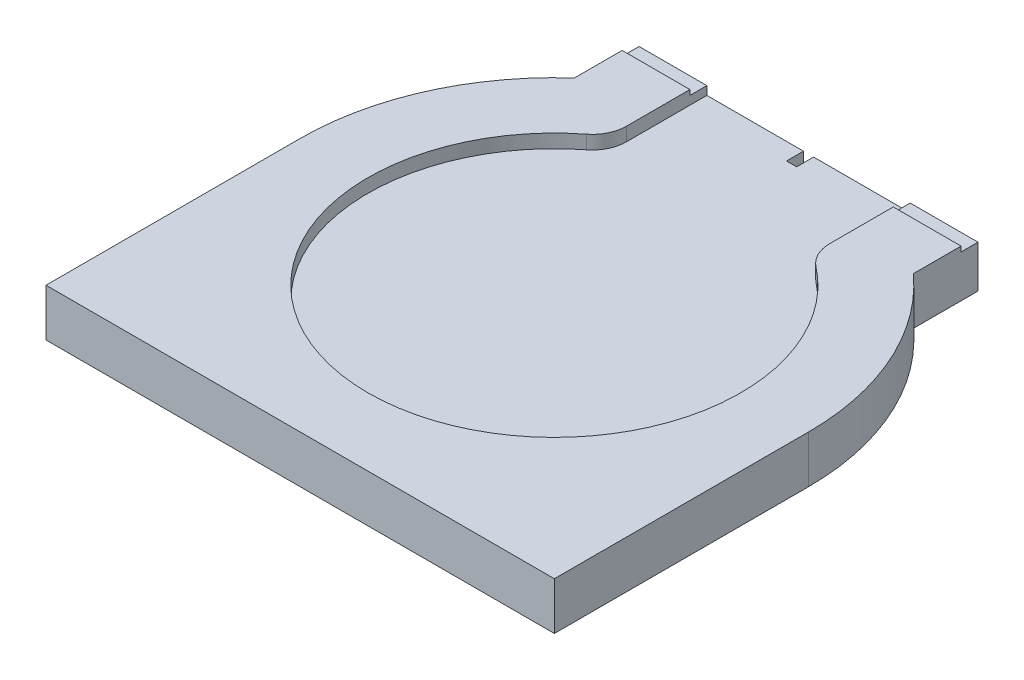
ISO-10303-21;
HEADER;
FILE_DESCRIPTION(('STEP AP214'),'2;1');
FILE_NAME('part.step','',(''),(''),'','','');
FILE_SCHEMA(('AUTOMOTIVE_DESIGN { 1 0 10303 214 1 1 1 1 }'));
ENDSEC;
DATA;
#1=APPLICATION_CONTEXT('core data for automotive mechanical design processes');
#2=APPLICATION_PROTOCOL_DEFINITION('international standard','automotive_design',2000,#1);
#3=PRODUCT_CONTEXT('',#1,'mechanical');
#4=PRODUCT('Part','Part','',(#3));
#5=PRODUCT_RELATED_PRODUCT_CATEGORY('part','',(#4));
#6=PRODUCT_DEFINITION_FORMATION('','',#4);
#7=PRODUCT_DEFINITION_CONTEXT('part definition',#1,'design');
#8=PRODUCT_DEFINITION('design','',#6,#7);
#9=PRODUCT_DEFINITION_SHAPE('','',#8);
#10=(LENGTH_UNIT() NAMED_UNIT(*) SI_UNIT(.MILLI.,.METRE.));
#11=(NAMED_UNIT(*) PLANE_ANGLE_UNIT() SI_UNIT($,.RADIAN.));
#12=(NAMED_UNIT(*) SI_UNIT($,.STERADIAN.) SOLID_ANGLE_UNIT());
#13=UNCERTAINTY_MEASURE_WITH_UNIT(LENGTH_MEASURE(1.E-05),#10,'distance_accuracy_value','');
#14=(GEOMETRIC_REPRESENTATION_CONTEXT(3) GLOBAL_UNCERTAINTY_ASSIGNED_CONTEXT((#13)) GLOBAL_UNIT_ASSIGNED_CONTEXT((#10,
#11,#12)) REPRESENTATION_CONTEXT('',''));
#15=CARTESIAN_POINT('',(0.,0.,0.));
#16=DIRECTION('',(0.,0.,1.));
#17=DIRECTION('',(1.,0.,0.));
#18=AXIS2_PLACEMENT_3D('',#15,#16,#17);
#19=CARTESIAN_POINT('',(3.,0.8,-7.5));
#20=DIRECTION('',(0.,0.,1.));
#21=DIRECTION('',(1.,0.,0.));
#22=AXIS2_PLACEMENT_3D('',#19,#20,#21);
#23=PLANE('',#22);
#24=DIRECTION('',(0.,-1.,0.));
#25=VECTOR('',#24,1.);
#26=CARTESIAN_POINT('',(-5.,0.8,-7.5));
#27=LINE('',#26,#25);
#28=CARTESIAN_POINT('',(-5.,0.25,-7.5));
#29=VERTEX_POINT('',#28);
#30=CARTESIAN_POINT('',(-5.,-1.,-7.5));
#31=VERTEX_POINT('',#30);
#32=EDGE_CURVE('E340',#29,#31,#27,.T.);
#33=ORIENTED_EDGE('',*,*,#32,.F.);
#34=DIRECTION('',(-1.,0.,0.));
#35=VECTOR('',#34,1.);
#36=CARTESIAN_POINT('',(-0.15,0.25,-7.5));
#37=LINE('',#36,#35);
#38=CARTESIAN_POINT('',(-3.,0.25,-7.5));
#39=VERTEX_POINT('',#38);
#40=EDGE_CURVE('E228',#39,#29,#37,.T.);
#41=ORIENTED_EDGE('',*,*,#40,.F.);
#42=DIRECTION('',(0.,-1.,0.));
#43=VECTOR('',#42,1.);
#44=CARTESIAN_POINT('',(-3.,0.8,-7.5));
#45=LINE('',#44,#43);
#46=CARTESIAN_POINT('',(-3.,0.,-7.5));
#47=VERTEX_POINT('',#46);
#48=EDGE_CURVE('E343',#39,#47,#45,.T.);
#49=ORIENTED_EDGE('',*,*,#48,.T.);
#50=DIRECTION('',(1.,0.,0.));
#51=VECTOR('',#50,1.);
#52=CARTESIAN_POINT('',(-3.,0.,-7.5));
#53=LINE('',#52,#51);
#54=CARTESIAN_POINT('',(-0.15,0.,-7.5));
#55=VERTEX_POINT('',#54);
#56=EDGE_CURVE('E285',#47,#55,#53,.T.);
#57=ORIENTED_EDGE('',*,*,#56,.T.);
#58=DIRECTION('',(0.,1.,0.));
#59=VECTOR('',#58,1.);
#60=CARTESIAN_POINT('',(-0.15,0.25,-7.5));
#61=LINE('',#60,#59);
#62=CARTESIAN_POINT('',(-0.15,-1.,-7.5));
#63=VERTEX_POINT('',#62);
#64=EDGE_CURVE('E225',#63,#55,#61,.T.);
#65=ORIENTED_EDGE('',*,*,#64,.F.);
#66=DIRECTION('',(1.,0.,0.));
#67=VECTOR('',#66,1.);
#68=CARTESIAN_POINT('',(-3.,-1.,-7.5));
#69=LINE('',#68,#67);
#70=EDGE_CURVE('E251',#31,#63,#69,.T.);
#71=ORIENTED_EDGE('',*,*,#70,.F.);
#72=EDGE_LOOP('',(#33,#41,#49,#57,#65,#71));
#73=FACE_BOUND('',#72,.T.);
#74=ADVANCED_FACE('F40',(#73),#23,.F.);
#75=CARTESIAN_POINT('',(-4.,0.8,-5.1234753829798));
#76=DIRECTION('',(0.,-1.,0.));
#77=DIRECTION('',(0.,0.,-1.));
#78=AXIS2_PLACEMENT_3D('',#75,#76,#77);
#79=CYLINDRICAL_SURFACE('',#78,1.);
#80=DIRECTION('',(0.,-1.,0.));
#81=VECTOR('',#80,1.);
#82=CARTESIAN_POINT('',(-3.,0.8,-5.1234753829798));
#83=LINE('',#82,#81);
#84=CARTESIAN_POINT('',(-3.,0.4,-5.1234753829798));
#85=VERTEX_POINT('',#84);
#86=CARTESIAN_POINT('',(-3.,0.,-5.1234753829798));
#87=VERTEX_POINT('',#86);
#88=EDGE_CURVE('E346',#85,#87,#83,.T.);
#89=ORIENTED_EDGE('',*,*,#88,.F.);
#90=CARTESIAN_POINT('',(-4.,0.4,-5.1234753829798));
#91=DIRECTION('',(0.,-1.,0.));
#92=DIRECTION('',(0.,0.,-1.));
#93=AXIS2_PLACEMENT_3D('',#90,#91,#92);
#94=CIRCLE('',#93,1.);
#95=CARTESIAN_POINT('',(-3.38461538461538,0.4,-4.33524840098291));
#96=VERTEX_POINT('',#95);
#97=EDGE_CURVE('E399',#85,#96,#94,.T.);
#98=ORIENTED_EDGE('',*,*,#97,.T.);
#99=DIRECTION('',(0.,-1.,0.));
#100=VECTOR('',#99,1.);
#101=CARTESIAN_POINT('',(-3.38461538461538,0.8,-4.33524840098291));
#102=LINE('',#101,#100);
#103=CARTESIAN_POINT('',(-3.38461538461538,0.,-4.33524840098291));
#104=VERTEX_POINT('',#103);
#105=EDGE_CURVE('E308',#96,#104,#102,.T.);
#106=ORIENTED_EDGE('',*,*,#105,.T.);
#107=CARTESIAN_POINT('',(-4.,0.,-5.1234753829798));
#108=DIRECTION('',(0.,1.,0.));
#109=DIRECTION('',(0.,0.,1.));
#110=AXIS2_PLACEMENT_3D('',#107,#108,#109);
#111=CIRCLE('',#110,1.);
#112=EDGE_CURVE('E284',#104,#87,#111,.T.);
#113=ORIENTED_EDGE('',*,*,#112,.T.);
#114=EDGE_LOOP('',(#89,#98,#106,#113));
#115=FACE_BOUND('',#114,.T.);
#116=ADVANCED_FACE('F42',(#115),#79,.T.);
#117=CARTESIAN_POINT('',(-3.,0.8,-5.5));
#118=DIRECTION('',(-1.,0.,0.));
#119=DIRECTION('',(0.,0.,1.));
#120=AXIS2_PLACEMENT_3D('',#117,#118,#119);
#121=PLANE('',#120);
#122=DIRECTION('',(0.,-1.,0.));
#123=VECTOR('',#122,1.);
#124=CARTESIAN_POINT('',(-3.,0.8,-7.));
#125=LINE('',#124,#123);
#126=CARTESIAN_POINT('',(-3.,0.4,-7.));
#127=VERTEX_POINT('',#126);
#128=CARTESIAN_POINT('',(-3.,0.25,-7.));
#129=VERTEX_POINT('',#128);
#130=EDGE_CURVE('E245',#127,#129,#125,.T.);
#131=ORIENTED_EDGE('',*,*,#130,.F.);
#132=DIRECTION('',(0.,0.,1.));
#133=VECTOR('',#132,1.);
#134=CARTESIAN_POINT('',(-3.,0.4,-5.5));
#135=LINE('',#134,#133);
#136=EDGE_CURVE('E55',#127,#85,#135,.T.);
#137=ORIENTED_EDGE('',*,*,#136,.T.);
#138=ORIENTED_EDGE('',*,*,#88,.T.);
#139=DIRECTION('',(0.,0.,-1.));
#140=VECTOR('',#139,1.);
#141=CARTESIAN_POINT('',(-3.,0.,-5.5));
#142=LINE('',#141,#140);
#143=EDGE_CURVE('E292',#87,#47,#142,.T.);
#144=ORIENTED_EDGE('',*,*,#143,.T.);
#145=ORIENTED_EDGE('',*,*,#48,.F.);
#146=DIRECTION('',(0.,0.,1.));
#147=VECTOR('',#146,1.);
#148=CARTESIAN_POINT('',(-3.,0.25,-5.5));
#149=LINE('',#148,#147);
#150=EDGE_CURVE('E63',#39,#129,#149,.T.);
#151=ORIENTED_EDGE('',*,*,#150,.T.);
#152=EDGE_LOOP('',(#131,#137,#138,#144,#145,#151));
#153=FACE_BOUND('',#152,.T.);
#154=ADVANCED_FACE('F462',(#153),#121,.F.);
#155=CARTESIAN_POINT('',(-5.,0.8,-7.5));
#156=DIRECTION('',(1.,0.,0.));
#157=DIRECTION('',(0.,0.,-1.));
#158=AXIS2_PLACEMENT_3D('',#155,#156,#157);
#159=PLANE('',#158);
#160=DIRECTION('',(0.,-1.,0.));
#161=VECTOR('',#160,1.);
#162=CARTESIAN_POINT('',(-5.,0.8,-5.59016994374947));
#163=LINE('',#162,#161);
#164=CARTESIAN_POINT('',(-5.,0.4,-5.59016994374947));
#165=VERTEX_POINT('',#164);
#166=CARTESIAN_POINT('',(-5.,-1.,-5.59016994374947));
#167=VERTEX_POINT('',#166);
#168=EDGE_CURVE('E201',#165,#167,#163,.T.);
#169=ORIENTED_EDGE('',*,*,#168,.F.);
#170=DIRECTION('',(0.,0.,-1.));
#171=VECTOR('',#170,1.);
#172=CARTESIAN_POINT('',(-5.,0.4,-7.5));
#173=LINE('',#172,#171);
#174=CARTESIAN_POINT('',(-5.,0.4,-7.));
#175=VERTEX_POINT('',#174);
#176=EDGE_CURVE('E189',#165,#175,#173,.T.);
#177=ORIENTED_EDGE('',*,*,#176,.T.);
#178=DIRECTION('',(0.,1.,0.));
#179=VECTOR('',#178,1.);
#180=CARTESIAN_POINT('',(-5.,0.55,-7.));
#181=LINE('',#180,#179);
#182=CARTESIAN_POINT('',(-5.,0.25,-7.));
#183=VERTEX_POINT('',#182);
#184=EDGE_CURVE('E199',#183,#175,#181,.T.);
#185=ORIENTED_EDGE('',*,*,#184,.F.);
#186=DIRECTION('',(0.,0.,-1.));
#187=VECTOR('',#186,1.);
#188=CARTESIAN_POINT('',(-5.,0.25,-7.));
#189=LINE('',#188,#187);
#190=EDGE_CURVE('E232',#183,#29,#189,.T.);
#191=ORIENTED_EDGE('',*,*,#190,.T.);
#192=ORIENTED_EDGE('',*,*,#32,.T.);
#193=DIRECTION('',(0.,0.,-1.));
#194=VECTOR('',#193,1.);
#195=CARTESIAN_POINT('',(-5.,-1.,-7.5));
#196=LINE('',#195,#194);
#197=EDGE_CURVE('E280',#167,#31,#196,.T.);
#198=ORIENTED_EDGE('',*,*,#197,.F.);
#199=EDGE_LOOP('',(#169,#177,#185,#191,#192,#198));
#200=FACE_BOUND('',#199,.T.);
#201=ADVANCED_FACE('F197',(#200),#159,.F.);
#202=CARTESIAN_POINT('',(0.,0.8,0.));
#203=DIRECTION('',(0.,-1.,0.));
#204=DIRECTION('',(0.,0.,-1.));
#205=AXIS2_PLACEMENT_3D('',#202,#203,#204);
#206=CYLINDRICAL_SURFACE('',#205,7.5);
#207=DIRECTION('',(0.,-1.,0.));
#208=VECTOR('',#207,1.);
#209=CARTESIAN_POINT('',(-7.5,0.8,0.));
#210=LINE('',#209,#208);
#211=CARTESIAN_POINT('',(-7.5,0.4,0.));
#212=VERTEX_POINT('',#211);
#213=CARTESIAN_POINT('',(-7.5,-1.,0.));
#214=VERTEX_POINT('',#213);
#215=EDGE_CURVE('E335',#212,#214,#210,.T.);
#216=ORIENTED_EDGE('',*,*,#215,.F.);
#217=CARTESIAN_POINT('',(0.,0.4,0.));
#218=DIRECTION('',(0.,-1.,0.));
#219=DIRECTION('',(0.,0.,-1.));
#220=AXIS2_PLACEMENT_3D('',#217,#218,#219);
#221=CIRCLE('',#220,7.5);
#222=EDGE_CURVE('E397',#212,#165,#221,.T.);
#223=ORIENTED_EDGE('',*,*,#222,.T.);
#224=ORIENTED_EDGE('',*,*,#168,.T.);
#225=CARTESIAN_POINT('',(0.,-1.,0.));
#226=DIRECTION('',(0.,-1.,0.));
#227=DIRECTION('',(0.,0.,-1.));
#228=AXIS2_PLACEMENT_3D('',#225,#226,#227);
#229=CIRCLE('',#228,7.5);
#230=EDGE_CURVE('E276',#214,#167,#229,.T.);
#231=ORIENTED_EDGE('',*,*,#230,.F.);
#232=EDGE_LOOP('',(#216,#223,#224,#231));
#233=FACE_BOUND('',#232,.T.);
#234=ADVANCED_FACE('F517',(#233),#206,.T.);
#235=CARTESIAN_POINT('',(-7.5,0.8,0.));
#236=DIRECTION('',(1.,0.,0.));
#237=DIRECTION('',(0.,0.,-1.));
#238=AXIS2_PLACEMENT_3D('',#235,#236,#237);
#239=PLANE('',#238);
#240=DIRECTION('',(0.,-1.,0.));
#241=VECTOR('',#240,1.);
#242=CARTESIAN_POINT('',(-7.5,0.8,7.5));
#243=LINE('',#242,#241);
#244=CARTESIAN_POINT('',(-7.5,0.4,7.5));
#245=VERTEX_POINT('',#244);
#246=CARTESIAN_POINT('',(-7.5,-1.,7.5));
#247=VERTEX_POINT('',#246);
#248=EDGE_CURVE('E332',#245,#247,#243,.T.);
#249=ORIENTED_EDGE('',*,*,#248,.F.);
#250=DIRECTION('',(0.,0.,-1.));
#251=VECTOR('',#250,1.);
#252=CARTESIAN_POINT('',(-7.5,0.4,0.));
#253=LINE('',#252,#251);
#254=EDGE_CURVE('E222',#245,#212,#253,.T.);
#255=ORIENTED_EDGE('',*,*,#254,.T.);
#256=ORIENTED_EDGE('',*,*,#215,.T.);
#257=DIRECTION('',(0.,0.,-1.));
#258=VECTOR('',#257,1.);
#259=CARTESIAN_POINT('',(-7.5,-1.,0.));
#260=LINE('',#259,#258);
#261=EDGE_CURVE('E272',#247,#214,#260,.T.);
#262=ORIENTED_EDGE('',*,*,#261,.F.);
#263=EDGE_LOOP('',(#249,#255,#256,#262));
#264=FACE_BOUND('',#263,.T.);
#265=ADVANCED_FACE('F513',(#264),#239,.F.);
#266=CARTESIAN_POINT('',(-7.5,0.8,7.5));
#267=DIRECTION('',(0.,0.,-1.));
#268=DIRECTION('',(-1.,0.,0.));
#269=AXIS2_PLACEMENT_3D('',#266,#267,#268);
#270=PLANE('',#269);
#271=DIRECTION('',(0.,-1.,0.));
#272=VECTOR('',#271,1.);
#273=CARTESIAN_POINT('',(7.5,0.8,7.5));
#274=LINE('',#273,#272);
#275=CARTESIAN_POINT('',(7.5,0.4,7.5));
#276=VERTEX_POINT('',#275);
#277=CARTESIAN_POINT('',(7.5,-1.,7.5));
#278=VERTEX_POINT('',#277);
#279=EDGE_CURVE('E329',#276,#278,#274,.T.);
#280=ORIENTED_EDGE('',*,*,#279,.F.);
#281=DIRECTION('',(-1.,0.,0.));
#282=VECTOR('',#281,1.);
#283=CARTESIAN_POINT('',(-7.5,0.4,7.5));
#284=LINE('',#283,#282);
#285=EDGE_CURVE('E420',#276,#245,#284,.T.);
#286=ORIENTED_EDGE('',*,*,#285,.T.);
#287=ORIENTED_EDGE('',*,*,#248,.T.);
#288=DIRECTION('',(-1.,0.,0.));
#289=VECTOR('',#288,1.);
#290=CARTESIAN_POINT('',(-7.5,-1.,7.5));
#291=LINE('',#290,#289);
#292=EDGE_CURVE('E268',#278,#247,#291,.T.);
#293=ORIENTED_EDGE('',*,*,#292,.F.);
#294=EDGE_LOOP('',(#280,#286,#287,#293));
#295=FACE_BOUND('',#294,.T.);
#296=ADVANCED_FACE('F509',(#295),#270,.F.);
#297=CARTESIAN_POINT('',(7.5,0.8,7.5));
#298=DIRECTION('',(-1.,0.,0.));
#299=DIRECTION('',(0.,0.,1.));
#300=AXIS2_PLACEMENT_3D('',#297,#298,#299);
#301=PLANE('',#300);
#302=DIRECTION('',(0.,-1.,0.));
#303=VECTOR('',#302,1.);
#304=CARTESIAN_POINT('',(7.5,0.8,0.));
#305=LINE('',#304,#303);
#306=CARTESIAN_POINT('',(7.5,0.4,0.));
#307=VERTEX_POINT('',#306);
#308=CARTESIAN_POINT('',(7.5,-1.,0.));
#309=VERTEX_POINT('',#308);
#310=EDGE_CURVE('E326',#307,#309,#305,.T.);
#311=ORIENTED_EDGE('',*,*,#310,.F.);
#312=DIRECTION('',(0.,0.,1.));
#313=VECTOR('',#312,1.);
#314=CARTESIAN_POINT('',(7.5,0.4,7.5));
#315=LINE('',#314,#313);
#316=EDGE_CURVE('E416',#307,#276,#315,.T.);
#317=ORIENTED_EDGE('',*,*,#316,.T.);
#318=ORIENTED_EDGE('',*,*,#279,.T.);
#319=DIRECTION('',(0.,0.,1.));
#320=VECTOR('',#319,1.);
#321=CARTESIAN_POINT('',(7.5,-1.,7.5));
#322=LINE('',#321,#320);
#323=EDGE_CURVE('E264',#309,#278,#322,.T.);
#324=ORIENTED_EDGE('',*,*,#323,.F.);
#325=EDGE_LOOP('',(#311,#317,#318,#324));
#326=FACE_BOUND('',#325,.T.);
#327=ADVANCED_FACE('F502',(#326),#301,.F.);
#328=CARTESIAN_POINT('',(0.,0.8,0.));
#329=DIRECTION('',(0.,-1.,0.));
#330=DIRECTION('',(0.,0.,-1.));
#331=AXIS2_PLACEMENT_3D('',#328,#329,#330);
#332=CYLINDRICAL_SURFACE('',#331,7.5);
#333=DIRECTION('',(0.,-1.,0.));
#334=VECTOR('',#333,1.);
#335=CARTESIAN_POINT('',(5.,0.8,-5.59016994374947));
#336=LINE('',#335,#334);
#337=CARTESIAN_POINT('',(5.,0.4,-5.59016994374947));
#338=VERTEX_POINT('',#337);
#339=CARTESIAN_POINT('',(5.,-1.,-5.59016994374947));
#340=VERTEX_POINT('',#339);
#341=EDGE_CURVE('E323',#338,#340,#336,.T.);
#342=ORIENTED_EDGE('',*,*,#341,.F.);
#343=CARTESIAN_POINT('',(0.,0.4,0.));
#344=DIRECTION('',(0.,-1.,0.));
#345=DIRECTION('',(0.,0.,-1.));
#346=AXIS2_PLACEMENT_3D('',#343,#344,#345);
#347=CIRCLE('',#346,7.5);
#348=EDGE_CURVE('E412',#338,#307,#347,.T.);
#349=ORIENTED_EDGE('',*,*,#348,.T.);
#350=ORIENTED_EDGE('',*,*,#310,.T.);
#351=CARTESIAN_POINT('',(0.,-1.,0.));
#352=DIRECTION('',(0.,-1.,0.));
#353=DIRECTION('',(0.,0.,-1.));
#354=AXIS2_PLACEMENT_3D('',#351,#352,#353);
#355=CIRCLE('',#354,7.5);
#356=EDGE_CURVE('E260',#340,#309,#355,.T.);
#357=ORIENTED_EDGE('',*,*,#356,.F.);
#358=EDGE_LOOP('',(#342,#349,#350,#357));
#359=FACE_BOUND('',#358,.T.);
#360=ADVANCED_FACE('F498',(#359),#332,.T.);
#361=CARTESIAN_POINT('',(5.,0.8,-7.5));
#362=DIRECTION('',(-1.,0.,0.));
#363=DIRECTION('',(0.,0.,1.));
#364=AXIS2_PLACEMENT_3D('',#361,#362,#363);
#365=PLANE('',#364);
#366=DIRECTION('',(0.,-1.,0.));
#367=VECTOR('',#366,1.);
#368=CARTESIAN_POINT('',(5.,0.55,-7.));
#369=LINE('',#368,#367);
#370=CARTESIAN_POINT('',(5.,0.4,-7.));
#371=VERTEX_POINT('',#370);
#372=CARTESIAN_POINT('',(5.,0.25,-7.));
#373=VERTEX_POINT('',#372);
#374=EDGE_CURVE('E231',#371,#373,#369,.T.);
#375=ORIENTED_EDGE('',*,*,#374,.F.);
#376=DIRECTION('',(0.,0.,1.));
#377=VECTOR('',#376,1.);
#378=CARTESIAN_POINT('',(5.,0.4,-7.5));
#379=LINE('',#378,#377);
#380=EDGE_CURVE('E408',#371,#338,#379,.T.);
#381=ORIENTED_EDGE('',*,*,#380,.T.);
#382=ORIENTED_EDGE('',*,*,#341,.T.);
#383=DIRECTION('',(0.,0.,1.));
#384=VECTOR('',#383,1.);
#385=CARTESIAN_POINT('',(5.,-1.,-5.59016994374947));
#386=LINE('',#385,#384);
#387=CARTESIAN_POINT('',(5.,-1.,-7.5));
#388=VERTEX_POINT('',#387);
#389=EDGE_CURVE('E255',#388,#340,#386,.T.);
#390=ORIENTED_EDGE('',*,*,#389,.F.);
#391=DIRECTION('',(0.,-1.,0.));
#392=VECTOR('',#391,1.);
#393=CARTESIAN_POINT('',(5.,0.8,-7.5));
#394=LINE('',#393,#392);
#395=CARTESIAN_POINT('',(5.,0.25,-7.5));
#396=VERTEX_POINT('',#395);
#397=EDGE_CURVE('E320',#396,#388,#394,.T.);
#398=ORIENTED_EDGE('',*,*,#397,.F.);
#399=DIRECTION('',(0.,0.,-1.));
#400=VECTOR('',#399,1.);
#401=CARTESIAN_POINT('',(5.,0.25,-7.));
#402=LINE('',#401,#400);
#403=EDGE_CURVE('E208',#373,#396,#402,.T.);
#404=ORIENTED_EDGE('',*,*,#403,.F.);
#405=EDGE_LOOP('',(#375,#381,#382,#390,#398,#404));
#406=FACE_BOUND('',#405,.T.);
#407=ADVANCED_FACE('F491',(#406),#365,.F.);
#408=CARTESIAN_POINT('',(0.15,-1.,-7.5));
#409=VERTEX_POINT('',#408);
#410=EDGE_CURVE('E256',#409,#388,#69,.T.);
#411=ORIENTED_EDGE('',*,*,#410,.F.);
#412=DIRECTION('',(0.,-1.,0.));
#413=VECTOR('',#412,1.);
#414=CARTESIAN_POINT('',(0.15,0.25,-7.5));
#415=LINE('',#414,#413);
#416=CARTESIAN_POINT('',(0.15,0.,-7.5));
#417=VERTEX_POINT('',#416);
#418=EDGE_CURVE('E221',#417,#409,#415,.T.);
#419=ORIENTED_EDGE('',*,*,#418,.F.);
#420=CARTESIAN_POINT('',(3.,0.,-7.5));
#421=VERTEX_POINT('',#420);
#422=EDGE_CURVE('E250',#417,#421,#53,.T.);
#423=ORIENTED_EDGE('',*,*,#422,.T.);
#424=DIRECTION('',(0.,-1.,0.));
#425=VECTOR('',#424,1.);
#426=CARTESIAN_POINT('',(3.,0.8,-7.5));
#427=LINE('',#426,#425);
#428=CARTESIAN_POINT('',(3.,0.25,-7.5));
#429=VERTEX_POINT('',#428);
#430=EDGE_CURVE('E317',#429,#421,#427,.T.);
#431=ORIENTED_EDGE('',*,*,#430,.F.);
#432=DIRECTION('',(-1.,0.,0.));
#433=VECTOR('',#432,1.);
#434=CARTESIAN_POINT('',(5.,0.25,-7.5));
#435=LINE('',#434,#433);
#436=EDGE_CURVE('E218',#396,#429,#435,.T.);
#437=ORIENTED_EDGE('',*,*,#436,.F.);
#438=ORIENTED_EDGE('',*,*,#397,.T.);
#439=EDGE_LOOP('',(#411,#419,#423,#431,#437,#438));
#440=FACE_BOUND('',#439,.T.);
#441=ADVANCED_FACE('F374',(#440),#23,.F.);
#442=CARTESIAN_POINT('',(3.,0.8,-5.5));
#443=DIRECTION('',(1.,0.,0.));
#444=DIRECTION('',(0.,0.,-1.));
#445=AXIS2_PLACEMENT_3D('',#442,#443,#444);
#446=PLANE('',#445);
#447=DIRECTION('',(0.,-1.,0.));
#448=VECTOR('',#447,1.);
#449=CARTESIAN_POINT('',(3.,0.8,-5.1234753829798));
#450=LINE('',#449,#448);
#451=CARTESIAN_POINT('',(3.,0.4,-5.1234753829798));
#452=VERTEX_POINT('',#451);
#453=CARTESIAN_POINT('',(3.,0.,-5.1234753829798));
#454=VERTEX_POINT('',#453);
#455=EDGE_CURVE('E314',#452,#454,#450,.T.);
#456=ORIENTED_EDGE('',*,*,#455,.F.);
#457=DIRECTION('',(0.,0.,-1.));
#458=VECTOR('',#457,1.);
#459=CARTESIAN_POINT('',(3.,0.4,-5.5));
#460=LINE('',#459,#458);
#461=CARTESIAN_POINT('',(3.,0.4,-7.));
#462=VERTEX_POINT('',#461);
#463=EDGE_CURVE('E385',#452,#462,#460,.T.);
#464=ORIENTED_EDGE('',*,*,#463,.T.);
#465=DIRECTION('',(0.,1.,0.));
#466=VECTOR('',#465,1.);
#467=CARTESIAN_POINT('',(3.,0.8,-7.));
#468=LINE('',#467,#466);
#469=CARTESIAN_POINT('',(3.,0.25,-7.));
#470=VERTEX_POINT('',#469);
#471=EDGE_CURVE('E235',#470,#462,#468,.T.);
#472=ORIENTED_EDGE('',*,*,#471,.F.);
#473=DIRECTION('',(0.,0.,-1.));
#474=VECTOR('',#473,1.);
#475=CARTESIAN_POINT('',(3.,0.25,-5.5));
#476=LINE('',#475,#474);
#477=EDGE_CURVE('E49',#470,#429,#476,.T.);
#478=ORIENTED_EDGE('',*,*,#477,.T.);
#479=ORIENTED_EDGE('',*,*,#430,.T.);
#480=DIRECTION('',(0.,0.,1.));
#481=VECTOR('',#480,1.);
#482=CARTESIAN_POINT('',(3.,0.,-5.5));
#483=LINE('',#482,#481);
#484=EDGE_CURVE('E296',#421,#454,#483,.T.);
#485=ORIENTED_EDGE('',*,*,#484,.T.);
#486=EDGE_LOOP('',(#456,#464,#472,#478,#479,#485));
#487=FACE_BOUND('',#486,.T.);
#488=ADVANCED_FACE('F366',(#487),#446,.F.);
#489=CARTESIAN_POINT('',(4.,0.8,-5.1234753829798));
#490=DIRECTION('',(0.,-1.,0.));
#491=DIRECTION('',(0.,0.,-1.));
#492=AXIS2_PLACEMENT_3D('',#489,#490,#491);
#493=CYLINDRICAL_SURFACE('',#492,1.);
#494=DIRECTION('',(0.,-1.,0.));
#495=VECTOR('',#494,1.);
#496=CARTESIAN_POINT('',(3.38461538461539,0.8,-4.33524840098291));
#497=LINE('',#496,#495);
#498=CARTESIAN_POINT('',(3.38461538461539,0.4,-4.33524840098291));
#499=VERTEX_POINT('',#498);
#500=CARTESIAN_POINT('',(3.38461538461539,0.,-4.33524840098291));
#501=VERTEX_POINT('',#500);
#502=EDGE_CURVE('E311',#499,#501,#497,.T.);
#503=ORIENTED_EDGE('',*,*,#502,.F.);
#504=CARTESIAN_POINT('',(4.,0.4,-5.1234753829798));
#505=DIRECTION('',(0.,-1.,0.));
#506=DIRECTION('',(0.,0.,-1.));
#507=AXIS2_PLACEMENT_3D('',#504,#505,#506);
#508=CIRCLE('',#507,1.);
#509=EDGE_CURVE('E390',#499,#452,#508,.T.);
#510=ORIENTED_EDGE('',*,*,#509,.T.);
#511=ORIENTED_EDGE('',*,*,#455,.T.);
#512=CARTESIAN_POINT('',(4.,0.,-5.1234753829798));
#513=DIRECTION('',(0.,1.,0.));
#514=DIRECTION('',(0.,0.,-1.));
#515=AXIS2_PLACEMENT_3D('',#512,#513,#514);
#516=CIRCLE('',#515,1.);
#517=EDGE_CURVE('E300',#454,#501,#516,.T.);
#518=ORIENTED_EDGE('',*,*,#517,.T.);
#519=EDGE_LOOP('',(#503,#510,#511,#518));
#520=FACE_BOUND('',#519,.T.);
#521=ADVANCED_FACE('F389',(#520),#493,.T.);
#522=CARTESIAN_POINT('',(0.,0.8,0.));
#523=DIRECTION('',(0.,-1.,0.));
#524=DIRECTION('',(0.,0.,-1.));
#525=AXIS2_PLACEMENT_3D('',#522,#523,#524);
#526=CYLINDRICAL_SURFACE('',#525,5.5);
#527=ORIENTED_EDGE('',*,*,#105,.F.);
#528=CARTESIAN_POINT('',(0.,0.4,0.));
#529=DIRECTION('',(0.,-1.,0.));
#530=DIRECTION('',(0.,0.,-1.));
#531=AXIS2_PLACEMENT_3D('',#528,#529,#530);
#532=CIRCLE('',#531,5.5);
#533=EDGE_CURVE('E393',#96,#499,#532,.F.);
#534=ORIENTED_EDGE('',*,*,#533,.T.);
#535=ORIENTED_EDGE('',*,*,#502,.T.);
#536=CARTESIAN_POINT('',(0.,0.,0.));
#537=DIRECTION('',(0.,-1.,0.));
#538=DIRECTION('',(0.,0.,1.));
#539=AXIS2_PLACEMENT_3D('',#536,#537,#538);
#540=CIRCLE('',#539,5.5);
#541=EDGE_CURVE('E304',#501,#104,#540,.T.);
#542=ORIENTED_EDGE('',*,*,#541,.T.);
#543=EDGE_LOOP('',(#527,#534,#535,#542));
#544=FACE_BOUND('',#543,.T.);
#545=ADVANCED_FACE('F468',(#544),#526,.F.);
#546=CARTESIAN_POINT('',(0.,-1.,0.));
#547=DIRECTION('',(0.,-1.,0.));
#548=DIRECTION('',(0.,0.,-1.));
#549=AXIS2_PLACEMENT_3D('',#546,#547,#548);
#550=PLANE('',#549);
#551=DIRECTION('',(0.,0.,-1.));
#552=VECTOR('',#551,1.);
#553=CARTESIAN_POINT('',(-0.15,-1.,-7.));
#554=LINE('',#553,#552);
#555=CARTESIAN_POINT('',(-0.15,-1.,-7.));
#556=VERTEX_POINT('',#555);
#557=EDGE_CURVE('E236',#556,#63,#554,.T.);
#558=ORIENTED_EDGE('',*,*,#557,.F.);
#559=DIRECTION('',(-1.,0.,0.));
#560=VECTOR('',#559,1.);
#561=CARTESIAN_POINT('',(0.15,-1.,-7.));
#562=LINE('',#561,#560);
#563=CARTESIAN_POINT('',(0.15,-1.,-7.));
#564=VERTEX_POINT('',#563);
#565=EDGE_CURVE('E435',#564,#556,#562,.T.);
#566=ORIENTED_EDGE('',*,*,#565,.F.);
#567=DIRECTION('',(0.,0.,-1.));
#568=VECTOR('',#567,1.);
#569=CARTESIAN_POINT('',(0.15,-1.,-7.));
#570=LINE('',#569,#568);
#571=EDGE_CURVE('E212',#564,#409,#570,.T.);
#572=ORIENTED_EDGE('',*,*,#571,.T.);
#573=ORIENTED_EDGE('',*,*,#410,.T.);
#574=ORIENTED_EDGE('',*,*,#389,.T.);
#575=ORIENTED_EDGE('',*,*,#356,.T.);
#576=ORIENTED_EDGE('',*,*,#323,.T.);
#577=ORIENTED_EDGE('',*,*,#292,.T.);
#578=ORIENTED_EDGE('',*,*,#261,.T.);
#579=ORIENTED_EDGE('',*,*,#230,.T.);
#580=ORIENTED_EDGE('',*,*,#197,.T.);
#581=ORIENTED_EDGE('',*,*,#70,.T.);
#582=EDGE_LOOP('',(#558,#566,#572,#573,#574,#575,#576,#577,#578,#579,#580,#581));
#583=FACE_BOUND('',#582,.T.);
#584=ADVANCED_FACE('F454',(#583),#550,.T.);
#585=CARTESIAN_POINT('',(0.,0.,0.));
#586=DIRECTION('',(0.,-1.,0.));
#587=DIRECTION('',(0.,0.,-1.));
#588=AXIS2_PLACEMENT_3D('',#585,#586,#587);
#589=PLANE('',#588);
#590=DIRECTION('',(1.,0.,0.));
#591=VECTOR('',#590,1.);
#592=CARTESIAN_POINT('',(0.,0.,-7.));
#593=LINE('',#592,#591);
#594=CARTESIAN_POINT('',(-0.15,0.,-7.));
#595=VERTEX_POINT('',#594);
#596=CARTESIAN_POINT('',(0.15,0.,-7.));
#597=VERTEX_POINT('',#596);
#598=EDGE_CURVE('E349',#595,#597,#593,.T.);
#599=ORIENTED_EDGE('',*,*,#598,.F.);
#600=DIRECTION('',(0.,0.,-1.));
#601=VECTOR('',#600,1.);
#602=CARTESIAN_POINT('',(-0.15,0.,0.));
#603=LINE('',#602,#601);
#604=EDGE_CURVE('E356',#595,#55,#603,.T.);
#605=ORIENTED_EDGE('',*,*,#604,.T.);
#606=ORIENTED_EDGE('',*,*,#56,.F.);
#607=ORIENTED_EDGE('',*,*,#143,.F.);
#608=ORIENTED_EDGE('',*,*,#112,.F.);
#609=ORIENTED_EDGE('',*,*,#541,.F.);
#610=ORIENTED_EDGE('',*,*,#517,.F.);
#611=ORIENTED_EDGE('',*,*,#484,.F.);
#612=ORIENTED_EDGE('',*,*,#422,.F.);
#613=DIRECTION('',(0.,0.,1.));
#614=VECTOR('',#613,1.);
#615=CARTESIAN_POINT('',(0.15,0.,0.));
#616=LINE('',#615,#614);
#617=EDGE_CURVE('E352',#417,#597,#616,.T.);
#618=ORIENTED_EDGE('',*,*,#617,.T.);
#619=EDGE_LOOP('',(#599,#605,#606,#607,#608,#609,#610,#611,#612,#618));
#620=FACE_BOUND('',#619,.T.);
#621=ADVANCED_FACE('F383',(#620),#589,.F.);
#622=CARTESIAN_POINT('',(0.,0.,-7.));
#623=DIRECTION('',(0.,0.,-1.));
#624=DIRECTION('',(-1.,0.,0.));
#625=AXIS2_PLACEMENT_3D('',#622,#623,#624);
#626=PLANE('',#625);
#627=ORIENTED_EDGE('',*,*,#598,.T.);
#628=DIRECTION('',(0.,-1.,0.));
#629=VECTOR('',#628,1.);
#630=CARTESIAN_POINT('',(0.15,0.25,-7.));
#631=LINE('',#630,#629);
#632=EDGE_CURVE('E432',#597,#564,#631,.T.);
#633=ORIENTED_EDGE('',*,*,#632,.T.);
#634=ORIENTED_EDGE('',*,*,#565,.T.);
#635=DIRECTION('',(0.,1.,0.));
#636=VECTOR('',#635,1.);
#637=CARTESIAN_POINT('',(-0.15,0.25,-7.));
#638=LINE('',#637,#636);
#639=EDGE_CURVE('E214',#556,#595,#638,.T.);
#640=ORIENTED_EDGE('',*,*,#639,.T.);
#641=EDGE_LOOP('',(#627,#633,#634,#640));
#642=FACE_BOUND('',#641,.T.);
#643=ADVANCED_FACE('F441',(#642),#626,.T.);
#644=CARTESIAN_POINT('',(0.15,0.25,-7.));
#645=DIRECTION('',(1.,0.,0.));
#646=DIRECTION('',(0.,1.,0.));
#647=AXIS2_PLACEMENT_3D('',#644,#645,#646);
#648=PLANE('',#647);
#649=ORIENTED_EDGE('',*,*,#418,.T.);
#650=ORIENTED_EDGE('',*,*,#571,.F.);
#651=ORIENTED_EDGE('',*,*,#632,.F.);
#652=ORIENTED_EDGE('',*,*,#617,.F.);
#653=EDGE_LOOP('',(#649,#650,#651,#652));
#654=FACE_BOUND('',#653,.T.);
#655=ADVANCED_FACE('F450',(#654),#648,.F.);
#656=CARTESIAN_POINT('',(-0.15,0.25,-7.));
#657=DIRECTION('',(-1.,0.,0.));
#658=DIRECTION('',(0.,0.,1.));
#659=AXIS2_PLACEMENT_3D('',#656,#657,#658);
#660=PLANE('',#659);
#661=ORIENTED_EDGE('',*,*,#639,.F.);
#662=ORIENTED_EDGE('',*,*,#557,.T.);
#663=ORIENTED_EDGE('',*,*,#64,.T.);
#664=ORIENTED_EDGE('',*,*,#604,.F.);
#665=EDGE_LOOP('',(#661,#662,#663,#664));
#666=FACE_BOUND('',#665,.T.);
#667=ADVANCED_FACE('F446',(#666),#660,.F.);
#668=DIRECTION('',(-1.,0.,0.));
#669=VECTOR('',#668,1.);
#670=CARTESIAN_POINT('',(0.,0.4,-7.));
#671=LINE('',#670,#669);
#672=EDGE_CURVE('E405',#371,#462,#671,.T.);
#673=ORIENTED_EDGE('',*,*,#672,.F.);
#674=ORIENTED_EDGE('',*,*,#374,.T.);
#675=DIRECTION('',(-1.,0.,0.));
#676=VECTOR('',#675,1.);
#677=CARTESIAN_POINT('',(5.,0.25,-7.));
#678=LINE('',#677,#676);
#679=EDGE_CURVE('E429',#373,#470,#678,.T.);
#680=ORIENTED_EDGE('',*,*,#679,.T.);
#681=ORIENTED_EDGE('',*,*,#471,.T.);
#682=EDGE_LOOP('',(#673,#674,#680,#681));
#683=FACE_BOUND('',#682,.T.);
#684=ADVANCED_FACE('F623',(#683),#626,.T.);
#685=CARTESIAN_POINT('',(5.,0.25,-7.));
#686=DIRECTION('',(0.,-1.,0.));
#687=DIRECTION('',(1.,0.,0.));
#688=AXIS2_PLACEMENT_3D('',#685,#686,#687);
#689=PLANE('',#688);
#690=ORIENTED_EDGE('',*,*,#679,.F.);
#691=ORIENTED_EDGE('',*,*,#403,.T.);
#692=ORIENTED_EDGE('',*,*,#436,.T.);
#693=ORIENTED_EDGE('',*,*,#477,.F.);
#694=EDGE_LOOP('',(#690,#691,#692,#693));
#695=FACE_BOUND('',#694,.T.);
#696=ADVANCED_FACE('F644',(#695),#689,.F.);
#697=CARTESIAN_POINT('',(-0.15,0.25,-7.));
#698=DIRECTION('',(0.,-1.,0.));
#699=DIRECTION('',(1.,0.,0.));
#700=AXIS2_PLACEMENT_3D('',#697,#698,#699);
#701=PLANE('',#700);
#702=ORIENTED_EDGE('',*,*,#40,.T.);
#703=ORIENTED_EDGE('',*,*,#190,.F.);
#704=DIRECTION('',(-1.,0.,0.));
#705=VECTOR('',#704,1.);
#706=CARTESIAN_POINT('',(-0.15,0.25,-7.));
#707=LINE('',#706,#705);
#708=EDGE_CURVE('E205',#129,#183,#707,.T.);
#709=ORIENTED_EDGE('',*,*,#708,.F.);
#710=ORIENTED_EDGE('',*,*,#150,.F.);
#711=EDGE_LOOP('',(#702,#703,#709,#710));
#712=FACE_BOUND('',#711,.T.);
#713=ADVANCED_FACE('F651',(#712),#701,.F.);
#714=DIRECTION('',(-1.,0.,0.));
#715=VECTOR('',#714,1.);
#716=CARTESIAN_POINT('',(0.,0.4,-7.));
#717=LINE('',#716,#715);
#718=EDGE_CURVE('E11',#127,#175,#717,.T.);
#719=ORIENTED_EDGE('',*,*,#718,.F.);
#720=ORIENTED_EDGE('',*,*,#130,.T.);
#721=ORIENTED_EDGE('',*,*,#708,.T.);
#722=ORIENTED_EDGE('',*,*,#184,.T.);
#723=EDGE_LOOP('',(#719,#720,#721,#722));
#724=FACE_BOUND('',#723,.T.);
#725=ADVANCED_FACE('F204',(#724),#626,.T.);
#726=CARTESIAN_POINT('',(0.,0.4,0.));
#727=DIRECTION('',(0.,-1.,0.));
#728=DIRECTION('',(0.,0.,-1.));
#729=AXIS2_PLACEMENT_3D('',#726,#727,#728);
#730=PLANE('',#729);
#731=ORIENTED_EDGE('',*,*,#285,.F.);
#732=ORIENTED_EDGE('',*,*,#316,.F.);
#733=ORIENTED_EDGE('',*,*,#348,.F.);
#734=ORIENTED_EDGE('',*,*,#380,.F.);
#735=ORIENTED_EDGE('',*,*,#672,.T.);
#736=ORIENTED_EDGE('',*,*,#463,.F.);
#737=ORIENTED_EDGE('',*,*,#509,.F.);
#738=ORIENTED_EDGE('',*,*,#533,.F.);
#739=ORIENTED_EDGE('',*,*,#97,.F.);
#740=ORIENTED_EDGE('',*,*,#136,.F.);
#741=ORIENTED_EDGE('',*,*,#718,.T.);
#742=ORIENTED_EDGE('',*,*,#176,.F.);
#743=ORIENTED_EDGE('',*,*,#222,.F.);
#744=ORIENTED_EDGE('',*,*,#254,.F.);
#745=EDGE_LOOP('',(#731,#732,#733,#734,#735,#736,#737,#738,#739,#740,#741,#742,#743,#744));
#746=FACE_BOUND('',#745,.T.);
#747=ADVANCED_FACE('F188',(#746),#730,.F.);
#748=CLOSED_SHELL('',(#74,#116,#154,#201,#234,#265,#296,#327,#360,#407,#441,#488,#521,#545,#584,
#621,#643,#655,#667,#684,#696,#713,#725,#747));
#749=MANIFOLD_SOLID_BREP('B2',#748);
#750=ADVANCED_BREP_SHAPE_REPRESENTATION('',(#18,#749),#14);
#751=SHAPE_DEFINITION_REPRESENTATION(#9,#750);
ENDSEC;
END-ISO-10303-21;
